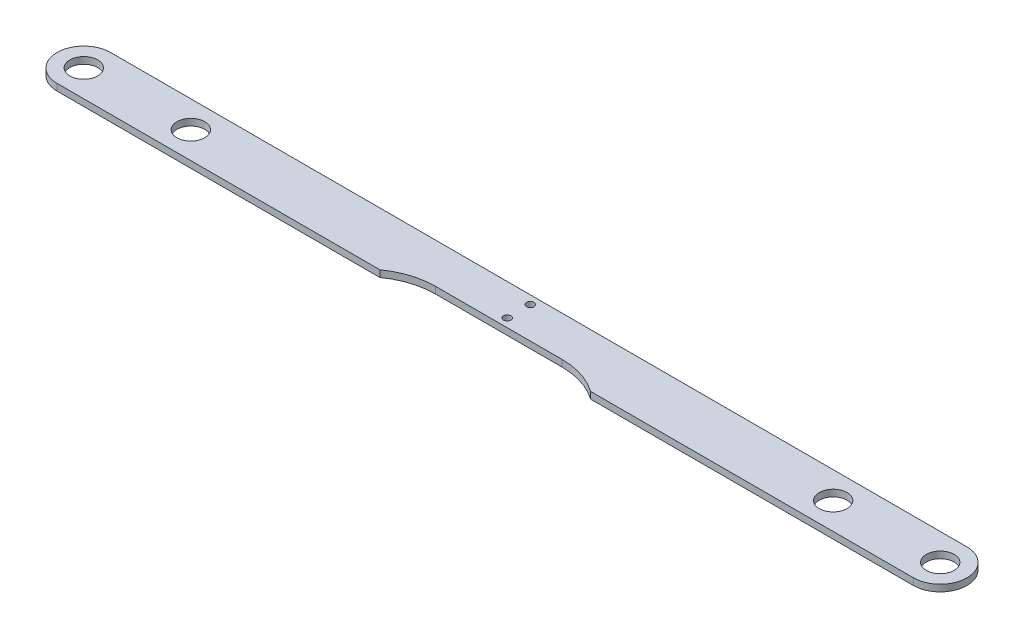
ISO-10303-21;
HEADER;
FILE_DESCRIPTION(('STEP AP214'),'2;1');
FILE_NAME('part.step','',(''),(''),'','','');
FILE_SCHEMA(('AUTOMOTIVE_DESIGN { 1 0 10303 214 1 1 1 1 }'));
ENDSEC;
DATA;
#1=APPLICATION_CONTEXT('core data for automotive mechanical design processes');
#2=APPLICATION_PROTOCOL_DEFINITION('international standard','automotive_design',2000,#1);
#3=PRODUCT_CONTEXT('',#1,'mechanical');
#4=PRODUCT('Part','Part','',(#3));
#5=PRODUCT_RELATED_PRODUCT_CATEGORY('part','',(#4));
#6=PRODUCT_DEFINITION_FORMATION('','',#4);
#7=PRODUCT_DEFINITION_CONTEXT('part definition',#1,'design');
#8=PRODUCT_DEFINITION('design','',#6,#7);
#9=PRODUCT_DEFINITION_SHAPE('','',#8);
#10=(LENGTH_UNIT() NAMED_UNIT(*) SI_UNIT(.MILLI.,.METRE.));
#11=(NAMED_UNIT(*) PLANE_ANGLE_UNIT() SI_UNIT($,.RADIAN.));
#12=(NAMED_UNIT(*) SI_UNIT($,.STERADIAN.) SOLID_ANGLE_UNIT());
#13=UNCERTAINTY_MEASURE_WITH_UNIT(LENGTH_MEASURE(1.E-05),#10,'distance_accuracy_value','');
#14=(GEOMETRIC_REPRESENTATION_CONTEXT(3) GLOBAL_UNCERTAINTY_ASSIGNED_CONTEXT((#13)) GLOBAL_UNIT_ASSIGNED_CONTEXT((#10,
#11,#12)) REPRESENTATION_CONTEXT('',''));
#15=CARTESIAN_POINT('',(0.,0.,0.));
#16=DIRECTION('',(0.,0.,1.));
#17=DIRECTION('',(1.,0.,0.));
#18=AXIS2_PLACEMENT_3D('',#15,#16,#17);
#19=CARTESIAN_POINT('',(101.6,1.5875,1.59999999999999));
#20=DIRECTION('',(0.,-1.,0.));
#21=DIRECTION('',(0.,0.,-1.));
#22=AXIS2_PLACEMENT_3D('',#19,#20,#21);
#23=PLANE('',#22);
#24=CARTESIAN_POINT('',(101.6,1.5875,1.59999999999999));
#25=DIRECTION('',(0.,1.,0.));
#26=DIRECTION('',(0.,0.,-1.));
#27=AXIS2_PLACEMENT_3D('',#24,#25,#26);
#28=CIRCLE('',#27,6.35000000000002);
#29=CARTESIAN_POINT('',(101.6,1.5875,7.94999999999997));
#30=VERTEX_POINT('',#29);
#31=CARTESIAN_POINT('',(101.6,1.5875,-4.75000000000007));
#32=VERTEX_POINT('',#31);
#33=EDGE_CURVE('E146',#30,#32,#28,.T.);
#34=ORIENTED_EDGE('',*,*,#33,.T.);
#35=DIRECTION('',(-1.,0.,0.));
#36=VECTOR('',#35,1.);
#37=CARTESIAN_POINT('',(101.6,1.5875,-4.75000000000007));
#38=LINE('',#37,#36);
#39=CARTESIAN_POINT('',(-101.6,1.5875,-4.75000000000001));
#40=VERTEX_POINT('',#39);
#41=EDGE_CURVE('E94',#32,#40,#38,.T.);
#42=ORIENTED_EDGE('',*,*,#41,.T.);
#43=CARTESIAN_POINT('',(-101.6,1.5875,1.59999999999999));
#44=DIRECTION('',(0.,1.,0.));
#45=DIRECTION('',(0.,0.,1.));
#46=AXIS2_PLACEMENT_3D('',#43,#44,#45);
#47=CIRCLE('',#46,6.35);
#48=CARTESIAN_POINT('',(-101.6,1.5875,7.94999999999999));
#49=VERTEX_POINT('',#48);
#50=EDGE_CURVE('E161',#40,#49,#47,.T.);
#51=ORIENTED_EDGE('',*,*,#50,.T.);
#52=DIRECTION('',(1.,0.,0.));
#53=VECTOR('',#52,1.);
#54=CARTESIAN_POINT('',(-101.6,1.5875,7.94999999999999));
#55=LINE('',#54,#53);
#56=CARTESIAN_POINT('',(-25.,1.5875,7.94999999999999));
#57=VERTEX_POINT('',#56);
#58=EDGE_CURVE('E174',#49,#57,#55,.T.);
#59=ORIENTED_EDGE('',*,*,#58,.T.);
#60=CARTESIAN_POINT('',(-15.,1.5875,21.9750000000001));
#61=DIRECTION('',(0.,-1.,0.));
#62=DIRECTION('',(0.,0.,1.));
#63=AXIS2_PLACEMENT_3D('',#60,#61,#62);
#64=CIRCLE('',#63,17.2250000000001);
#65=CARTESIAN_POINT('',(-15.,1.5875,4.75000000000001));
#66=VERTEX_POINT('',#65);
#67=EDGE_CURVE('E113',#57,#66,#64,.T.);
#68=ORIENTED_EDGE('',*,*,#67,.T.);
#69=DIRECTION('',(1.,0.,0.));
#70=VECTOR('',#69,1.);
#71=CARTESIAN_POINT('',(-15.,1.5875,4.75000000000001));
#72=LINE('',#71,#70);
#73=CARTESIAN_POINT('',(15.,1.5875,4.75));
#74=VERTEX_POINT('',#73);
#75=EDGE_CURVE('E107',#66,#74,#72,.T.);
#76=ORIENTED_EDGE('',*,*,#75,.T.);
#77=CARTESIAN_POINT('',(15.,1.5875,21.975));
#78=DIRECTION('',(0.,-1.,0.));
#79=DIRECTION('',(0.,0.,-1.));
#80=AXIS2_PLACEMENT_3D('',#77,#78,#79);
#81=CIRCLE('',#80,17.225);
#82=CARTESIAN_POINT('',(25.,1.5875,7.94999999999999));
#83=VERTEX_POINT('',#82);
#84=EDGE_CURVE('E111',#74,#83,#81,.T.);
#85=ORIENTED_EDGE('',*,*,#84,.T.);
#86=DIRECTION('',(1.,0.,0.));
#87=VECTOR('',#86,1.);
#88=CARTESIAN_POINT('',(25.,1.5875,7.94999999999999));
#89=LINE('',#88,#87);
#90=EDGE_CURVE('E51',#83,#30,#89,.T.);
#91=ORIENTED_EDGE('',*,*,#90,.T.);
#92=EDGE_LOOP('',(#34,#42,#51,#59,#68,#76,#85,#91));
#93=FACE_BOUND('',#92,.T.);
#94=CARTESIAN_POINT('',(0.,1.5875,-2.75));
#95=DIRECTION('',(0.,1.,0.));
#96=DIRECTION('',(0.,0.,1.));
#97=AXIS2_PLACEMENT_3D('',#94,#95,#96);
#98=CIRCLE('',#97,0.889000000000003);
#99=CARTESIAN_POINT('',(0.,1.5875,-1.861));
#100=VERTEX_POINT('',#99);
#101=EDGE_CURVE('E135',#100,#100,#98,.T.);
#102=ORIENTED_EDGE('',*,*,#101,.F.);
#103=EDGE_LOOP('',(#102));
#104=FACE_BOUND('',#103,.T.);
#105=CARTESIAN_POINT('',(0.,1.5875,2.75));
#106=DIRECTION('',(0.,1.,0.));
#107=DIRECTION('',(0.,0.,1.));
#108=AXIS2_PLACEMENT_3D('',#105,#106,#107);
#109=CIRCLE('',#108,0.889000000000003);
#110=CARTESIAN_POINT('',(0.,1.5875,3.639));
#111=VERTEX_POINT('',#110);
#112=EDGE_CURVE('E183',#111,#111,#109,.T.);
#113=ORIENTED_EDGE('',*,*,#112,.F.);
#114=EDGE_LOOP('',(#113));
#115=FACE_BOUND('',#114,.T.);
#116=CARTESIAN_POINT('',(-76.2,1.5875,1.59999999999999));
#117=DIRECTION('',(0.,1.,0.));
#118=DIRECTION('',(0.,0.,1.));
#119=AXIS2_PLACEMENT_3D('',#116,#117,#118);
#120=CIRCLE('',#119,3.302);
#121=CARTESIAN_POINT('',(-76.2,1.5875,4.90199999999999));
#122=VERTEX_POINT('',#121);
#123=EDGE_CURVE('E189',#122,#122,#120,.T.);
#124=ORIENTED_EDGE('',*,*,#123,.F.);
#125=EDGE_LOOP('',(#124));
#126=FACE_BOUND('',#125,.T.);
#127=CARTESIAN_POINT('',(-101.6,1.5875,1.59999999999999));
#128=DIRECTION('',(0.,1.,0.));
#129=DIRECTION('',(0.,0.,1.));
#130=AXIS2_PLACEMENT_3D('',#127,#128,#129);
#131=CIRCLE('',#130,3.302);
#132=CARTESIAN_POINT('',(-101.6,1.5875,4.90199999999999));
#133=VERTEX_POINT('',#132);
#134=EDGE_CURVE('E195',#133,#133,#131,.T.);
#135=ORIENTED_EDGE('',*,*,#134,.F.);
#136=EDGE_LOOP('',(#135));
#137=FACE_BOUND('',#136,.T.);
#138=CARTESIAN_POINT('',(101.6,1.5875,1.59999999999999));
#139=DIRECTION('',(0.,1.,0.));
#140=DIRECTION('',(0.,0.,1.));
#141=AXIS2_PLACEMENT_3D('',#138,#139,#140);
#142=CIRCLE('',#141,3.302);
#143=CARTESIAN_POINT('',(101.6,1.5875,4.90199999999999));
#144=VERTEX_POINT('',#143);
#145=EDGE_CURVE('E201',#144,#144,#142,.T.);
#146=ORIENTED_EDGE('',*,*,#145,.F.);
#147=EDGE_LOOP('',(#146));
#148=FACE_BOUND('',#147,.T.);
#149=CARTESIAN_POINT('',(76.2,1.5875,1.59999999999999));
#150=DIRECTION('',(0.,1.,0.));
#151=DIRECTION('',(0.,0.,1.));
#152=AXIS2_PLACEMENT_3D('',#149,#150,#151);
#153=CIRCLE('',#152,3.302);
#154=CARTESIAN_POINT('',(76.2,1.5875,4.90199999999999));
#155=VERTEX_POINT('',#154);
#156=EDGE_CURVE('E207',#155,#155,#153,.T.);
#157=ORIENTED_EDGE('',*,*,#156,.F.);
#158=EDGE_LOOP('',(#157));
#159=FACE_BOUND('',#158,.T.);
#160=ADVANCED_FACE('F34',(#93,#104,#115,#126,#137,#148,#159),#23,.F.);
#161=CARTESIAN_POINT('',(101.6,0.,1.59999999999999));
#162=DIRECTION('',(0.,-1.,0.));
#163=DIRECTION('',(0.,0.,-1.));
#164=AXIS2_PLACEMENT_3D('',#161,#162,#163);
#165=PLANE('',#164);
#166=CARTESIAN_POINT('',(101.6,0.,1.59999999999999));
#167=DIRECTION('',(0.,1.,0.));
#168=DIRECTION('',(0.,0.,1.));
#169=AXIS2_PLACEMENT_3D('',#166,#167,#168);
#170=CIRCLE('',#169,3.302);
#171=CARTESIAN_POINT('',(101.6,0.,4.90199999999999));
#172=VERTEX_POINT('',#171);
#173=EDGE_CURVE('E204',#172,#172,#170,.T.);
#174=ORIENTED_EDGE('',*,*,#173,.T.);
#175=EDGE_LOOP('',(#174));
#176=FACE_BOUND('',#175,.T.);
#177=CARTESIAN_POINT('',(-76.2,0.,1.59999999999999));
#178=DIRECTION('',(0.,1.,0.));
#179=DIRECTION('',(0.,0.,1.));
#180=AXIS2_PLACEMENT_3D('',#177,#178,#179);
#181=CIRCLE('',#180,3.302);
#182=CARTESIAN_POINT('',(-76.2,0.,4.90199999999999));
#183=VERTEX_POINT('',#182);
#184=EDGE_CURVE('E192',#183,#183,#181,.T.);
#185=ORIENTED_EDGE('',*,*,#184,.T.);
#186=EDGE_LOOP('',(#185));
#187=FACE_BOUND('',#186,.T.);
#188=CARTESIAN_POINT('',(0.,0.,-2.75));
#189=DIRECTION('',(0.,1.,0.));
#190=DIRECTION('',(0.,0.,1.));
#191=AXIS2_PLACEMENT_3D('',#188,#189,#190);
#192=CIRCLE('',#191,0.889000000000003);
#193=CARTESIAN_POINT('',(0.,0.,-1.861));
#194=VERTEX_POINT('',#193);
#195=EDGE_CURVE('E180',#194,#194,#192,.T.);
#196=ORIENTED_EDGE('',*,*,#195,.T.);
#197=EDGE_LOOP('',(#196));
#198=FACE_BOUND('',#197,.T.);
#199=CARTESIAN_POINT('',(101.6,0.,1.59999999999999));
#200=DIRECTION('',(0.,1.,0.));
#201=DIRECTION('',(0.,0.,-1.));
#202=AXIS2_PLACEMENT_3D('',#199,#200,#201);
#203=CIRCLE('',#202,6.35000000000002);
#204=CARTESIAN_POINT('',(101.6,0.,7.94999999999997));
#205=VERTEX_POINT('',#204);
#206=CARTESIAN_POINT('',(101.6,0.,-4.75000000000007));
#207=VERTEX_POINT('',#206);
#208=EDGE_CURVE('E131',#205,#207,#203,.T.);
#209=ORIENTED_EDGE('',*,*,#208,.F.);
#210=DIRECTION('',(1.,0.,0.));
#211=VECTOR('',#210,1.);
#212=CARTESIAN_POINT('',(25.,0.,7.94999999999999));
#213=LINE('',#212,#211);
#214=CARTESIAN_POINT('',(25.,0.,7.94999999999999));
#215=VERTEX_POINT('',#214);
#216=EDGE_CURVE('E86',#215,#205,#213,.T.);
#217=ORIENTED_EDGE('',*,*,#216,.F.);
#218=CARTESIAN_POINT('',(15.,0.,21.975));
#219=DIRECTION('',(0.,-1.,0.));
#220=DIRECTION('',(0.,0.,-1.));
#221=AXIS2_PLACEMENT_3D('',#218,#219,#220);
#222=CIRCLE('',#221,17.225);
#223=CARTESIAN_POINT('',(15.,0.,4.75));
#224=VERTEX_POINT('',#223);
#225=EDGE_CURVE('E80',#224,#215,#222,.T.);
#226=ORIENTED_EDGE('',*,*,#225,.F.);
#227=DIRECTION('',(1.,0.,0.));
#228=VECTOR('',#227,1.);
#229=CARTESIAN_POINT('',(-15.,0.,4.75000000000001));
#230=LINE('',#229,#228);
#231=CARTESIAN_POINT('',(-15.,0.,4.75000000000001));
#232=VERTEX_POINT('',#231);
#233=EDGE_CURVE('E121',#232,#224,#230,.T.);
#234=ORIENTED_EDGE('',*,*,#233,.F.);
#235=CARTESIAN_POINT('',(-15.,0.,21.9750000000001));
#236=DIRECTION('',(0.,-1.,0.));
#237=DIRECTION('',(0.,0.,1.));
#238=AXIS2_PLACEMENT_3D('',#235,#236,#237);
#239=CIRCLE('',#238,17.2250000000001);
#240=CARTESIAN_POINT('',(-25.,0.,7.94999999999999));
#241=VERTEX_POINT('',#240);
#242=EDGE_CURVE('E141',#241,#232,#239,.T.);
#243=ORIENTED_EDGE('',*,*,#242,.F.);
#244=DIRECTION('',(1.,0.,0.));
#245=VECTOR('',#244,1.);
#246=CARTESIAN_POINT('',(-101.6,0.,7.94999999999999));
#247=LINE('',#246,#245);
#248=CARTESIAN_POINT('',(-101.6,0.,7.94999999999999));
#249=VERTEX_POINT('',#248);
#250=EDGE_CURVE('E139',#249,#241,#247,.T.);
#251=ORIENTED_EDGE('',*,*,#250,.F.);
#252=CARTESIAN_POINT('',(-101.6,0.,1.59999999999999));
#253=DIRECTION('',(0.,1.,0.));
#254=DIRECTION('',(0.,0.,1.));
#255=AXIS2_PLACEMENT_3D('',#252,#253,#254);
#256=CIRCLE('',#255,6.35);
#257=CARTESIAN_POINT('',(-101.6,0.,-4.75000000000001));
#258=VERTEX_POINT('',#257);
#259=EDGE_CURVE('E137',#258,#249,#256,.T.);
#260=ORIENTED_EDGE('',*,*,#259,.F.);
#261=DIRECTION('',(-1.,0.,0.));
#262=VECTOR('',#261,1.);
#263=CARTESIAN_POINT('',(101.6,0.,-4.75000000000007));
#264=LINE('',#263,#262);
#265=EDGE_CURVE('E134',#207,#258,#264,.T.);
#266=ORIENTED_EDGE('',*,*,#265,.F.);
#267=EDGE_LOOP('',(#209,#217,#226,#234,#243,#251,#260,#266));
#268=FACE_BOUND('',#267,.T.);
#269=CARTESIAN_POINT('',(0.,0.,2.75));
#270=DIRECTION('',(0.,1.,0.));
#271=DIRECTION('',(0.,0.,1.));
#272=AXIS2_PLACEMENT_3D('',#269,#270,#271);
#273=CIRCLE('',#272,0.889000000000003);
#274=CARTESIAN_POINT('',(0.,0.,3.639));
#275=VERTEX_POINT('',#274);
#276=EDGE_CURVE('E186',#275,#275,#273,.T.);
#277=ORIENTED_EDGE('',*,*,#276,.T.);
#278=EDGE_LOOP('',(#277));
#279=FACE_BOUND('',#278,.T.);
#280=CARTESIAN_POINT('',(-101.6,0.,1.59999999999999));
#281=DIRECTION('',(0.,1.,0.));
#282=DIRECTION('',(0.,0.,1.));
#283=AXIS2_PLACEMENT_3D('',#280,#281,#282);
#284=CIRCLE('',#283,3.302);
#285=CARTESIAN_POINT('',(-101.6,0.,4.90199999999999));
#286=VERTEX_POINT('',#285);
#287=EDGE_CURVE('E198',#286,#286,#284,.T.);
#288=ORIENTED_EDGE('',*,*,#287,.T.);
#289=EDGE_LOOP('',(#288));
#290=FACE_BOUND('',#289,.T.);
#291=CARTESIAN_POINT('',(76.2,0.,1.59999999999999));
#292=DIRECTION('',(0.,1.,0.));
#293=DIRECTION('',(0.,0.,1.));
#294=AXIS2_PLACEMENT_3D('',#291,#292,#293);
#295=CIRCLE('',#294,3.302);
#296=CARTESIAN_POINT('',(76.2,0.,4.90199999999999));
#297=VERTEX_POINT('',#296);
#298=EDGE_CURVE('E210',#297,#297,#295,.T.);
#299=ORIENTED_EDGE('',*,*,#298,.T.);
#300=EDGE_LOOP('',(#299));
#301=FACE_BOUND('',#300,.T.);
#302=ADVANCED_FACE('F165',(#176,#187,#198,#268,#279,#290,#301),#165,.T.);
#303=CARTESIAN_POINT('',(101.6,1.5875,1.59999999999999));
#304=DIRECTION('',(0.,-1.,0.));
#305=DIRECTION('',(0.,0.,-1.));
#306=AXIS2_PLACEMENT_3D('',#303,#304,#305);
#307=CYLINDRICAL_SURFACE('',#306,6.35000000000002);
#308=ORIENTED_EDGE('',*,*,#208,.T.);
#309=DIRECTION('',(0.,-1.,0.));
#310=VECTOR('',#309,1.);
#311=CARTESIAN_POINT('',(101.6,1.5875,-4.75000000000007));
#312=LINE('',#311,#310);
#313=EDGE_CURVE('E11',#32,#207,#312,.T.);
#314=ORIENTED_EDGE('',*,*,#313,.F.);
#315=ORIENTED_EDGE('',*,*,#33,.F.);
#316=DIRECTION('',(0.,-1.,0.));
#317=VECTOR('',#316,1.);
#318=CARTESIAN_POINT('',(101.6,1.5875,7.94999999999997));
#319=LINE('',#318,#317);
#320=EDGE_CURVE('E127',#30,#205,#319,.T.);
#321=ORIENTED_EDGE('',*,*,#320,.T.);
#322=EDGE_LOOP('',(#308,#314,#315,#321));
#323=FACE_BOUND('',#322,.T.);
#324=ADVANCED_FACE('F36',(#323),#307,.T.);
#325=CARTESIAN_POINT('',(101.6,1.5875,-4.75000000000007));
#326=DIRECTION('',(0.,0.,1.));
#327=DIRECTION('',(1.,0.,0.));
#328=AXIS2_PLACEMENT_3D('',#325,#326,#327);
#329=PLANE('',#328);
#330=ORIENTED_EDGE('',*,*,#265,.T.);
#331=DIRECTION('',(0.,-1.,0.));
#332=VECTOR('',#331,1.);
#333=CARTESIAN_POINT('',(-101.6,1.5875,-4.75000000000001));
#334=LINE('',#333,#332);
#335=EDGE_CURVE('E43',#40,#258,#334,.T.);
#336=ORIENTED_EDGE('',*,*,#335,.F.);
#337=ORIENTED_EDGE('',*,*,#41,.F.);
#338=ORIENTED_EDGE('',*,*,#313,.T.);
#339=EDGE_LOOP('',(#330,#336,#337,#338));
#340=FACE_BOUND('',#339,.T.);
#341=ADVANCED_FACE('F242',(#340),#329,.F.);
#342=CARTESIAN_POINT('',(-101.6,1.5875,1.59999999999999));
#343=DIRECTION('',(0.,-1.,0.));
#344=DIRECTION('',(0.,0.,-1.));
#345=AXIS2_PLACEMENT_3D('',#342,#343,#344);
#346=CYLINDRICAL_SURFACE('',#345,6.35);
#347=ORIENTED_EDGE('',*,*,#259,.T.);
#348=DIRECTION('',(0.,-1.,0.));
#349=VECTOR('',#348,1.);
#350=CARTESIAN_POINT('',(-101.6,1.5875,7.94999999999999));
#351=LINE('',#350,#349);
#352=EDGE_CURVE('E153',#49,#249,#351,.T.);
#353=ORIENTED_EDGE('',*,*,#352,.F.);
#354=ORIENTED_EDGE('',*,*,#50,.F.);
#355=ORIENTED_EDGE('',*,*,#335,.T.);
#356=EDGE_LOOP('',(#347,#353,#354,#355));
#357=FACE_BOUND('',#356,.T.);
#358=ADVANCED_FACE('F159',(#357),#346,.T.);
#359=CARTESIAN_POINT('',(-101.6,1.5875,7.94999999999999));
#360=DIRECTION('',(0.,0.,-1.));
#361=DIRECTION('',(-1.,0.,0.));
#362=AXIS2_PLACEMENT_3D('',#359,#360,#361);
#363=PLANE('',#362);
#364=ORIENTED_EDGE('',*,*,#250,.T.);
#365=DIRECTION('',(0.,-1.,0.));
#366=VECTOR('',#365,1.);
#367=CARTESIAN_POINT('',(-25.,1.5875,7.94999999999999));
#368=LINE('',#367,#366);
#369=EDGE_CURVE('E150',#57,#241,#368,.T.);
#370=ORIENTED_EDGE('',*,*,#369,.F.);
#371=ORIENTED_EDGE('',*,*,#58,.F.);
#372=ORIENTED_EDGE('',*,*,#352,.T.);
#373=EDGE_LOOP('',(#364,#370,#371,#372));
#374=FACE_BOUND('',#373,.T.);
#375=ADVANCED_FACE('F170',(#374),#363,.F.);
#376=CARTESIAN_POINT('',(-15.,1.5875,21.9750000000001));
#377=DIRECTION('',(0.,-1.,0.));
#378=DIRECTION('',(0.,0.,-1.));
#379=AXIS2_PLACEMENT_3D('',#376,#377,#378);
#380=CYLINDRICAL_SURFACE('',#379,17.2250000000001);
#381=ORIENTED_EDGE('',*,*,#242,.T.);
#382=DIRECTION('',(0.,-1.,0.));
#383=VECTOR('',#382,1.);
#384=CARTESIAN_POINT('',(-15.,1.5875,4.75000000000001));
#385=LINE('',#384,#383);
#386=EDGE_CURVE('E122',#66,#232,#385,.T.);
#387=ORIENTED_EDGE('',*,*,#386,.F.);
#388=ORIENTED_EDGE('',*,*,#67,.F.);
#389=ORIENTED_EDGE('',*,*,#369,.T.);
#390=EDGE_LOOP('',(#381,#387,#388,#389));
#391=FACE_BOUND('',#390,.T.);
#392=ADVANCED_FACE('F173',(#391),#380,.F.);
#393=CARTESIAN_POINT('',(-15.,1.5875,4.75000000000001));
#394=DIRECTION('',(0.,0.,-1.));
#395=DIRECTION('',(-1.,0.,0.));
#396=AXIS2_PLACEMENT_3D('',#393,#394,#395);
#397=PLANE('',#396);
#398=ORIENTED_EDGE('',*,*,#233,.T.);
#399=DIRECTION('',(0.,-1.,0.));
#400=VECTOR('',#399,1.);
#401=CARTESIAN_POINT('',(15.,1.5875,4.75));
#402=LINE('',#401,#400);
#403=EDGE_CURVE('E118',#74,#224,#402,.T.);
#404=ORIENTED_EDGE('',*,*,#403,.F.);
#405=ORIENTED_EDGE('',*,*,#75,.F.);
#406=ORIENTED_EDGE('',*,*,#386,.T.);
#407=EDGE_LOOP('',(#398,#404,#405,#406));
#408=FACE_BOUND('',#407,.T.);
#409=ADVANCED_FACE('F119',(#408),#397,.F.);
#410=CARTESIAN_POINT('',(15.,1.5875,21.975));
#411=DIRECTION('',(0.,-1.,0.));
#412=DIRECTION('',(0.,0.,-1.));
#413=AXIS2_PLACEMENT_3D('',#410,#411,#412);
#414=CYLINDRICAL_SURFACE('',#413,17.225);
#415=ORIENTED_EDGE('',*,*,#225,.T.);
#416=DIRECTION('',(0.,-1.,0.));
#417=VECTOR('',#416,1.);
#418=CARTESIAN_POINT('',(25.,1.5875,7.94999999999999));
#419=LINE('',#418,#417);
#420=EDGE_CURVE('E123',#83,#215,#419,.T.);
#421=ORIENTED_EDGE('',*,*,#420,.F.);
#422=ORIENTED_EDGE('',*,*,#84,.F.);
#423=ORIENTED_EDGE('',*,*,#403,.T.);
#424=EDGE_LOOP('',(#415,#421,#422,#423));
#425=FACE_BOUND('',#424,.T.);
#426=ADVANCED_FACE('F125',(#425),#414,.F.);
#427=CARTESIAN_POINT('',(25.,1.5875,7.94999999999999));
#428=DIRECTION('',(0.,0.,-1.));
#429=DIRECTION('',(-1.,0.,0.));
#430=AXIS2_PLACEMENT_3D('',#427,#428,#429);
#431=PLANE('',#430);
#432=ORIENTED_EDGE('',*,*,#216,.T.);
#433=ORIENTED_EDGE('',*,*,#320,.F.);
#434=ORIENTED_EDGE('',*,*,#90,.F.);
#435=ORIENTED_EDGE('',*,*,#420,.T.);
#436=EDGE_LOOP('',(#432,#433,#434,#435));
#437=FACE_BOUND('',#436,.T.);
#438=ADVANCED_FACE('F230',(#437),#431,.F.);
#439=CARTESIAN_POINT('',(0.,1.5875,-2.75));
#440=DIRECTION('',(0.,-1.,0.));
#441=DIRECTION('',(0.,0.,-1.));
#442=AXIS2_PLACEMENT_3D('',#439,#440,#441);
#443=CYLINDRICAL_SURFACE('',#442,0.889000000000003);
#444=ORIENTED_EDGE('',*,*,#101,.T.);
#445=EDGE_LOOP('',(#444));
#446=FACE_BOUND('',#445,.T.);
#447=ORIENTED_EDGE('',*,*,#195,.F.);
#448=EDGE_LOOP('',(#447));
#449=FACE_BOUND('',#448,.T.);
#450=ADVANCED_FACE('F227',(#446,#449),#443,.F.);
#451=CARTESIAN_POINT('',(0.,1.5875,2.75));
#452=DIRECTION('',(0.,-1.,0.));
#453=DIRECTION('',(0.,0.,-1.));
#454=AXIS2_PLACEMENT_3D('',#451,#452,#453);
#455=CYLINDRICAL_SURFACE('',#454,0.889000000000003);
#456=ORIENTED_EDGE('',*,*,#112,.T.);
#457=EDGE_LOOP('',(#456));
#458=FACE_BOUND('',#457,.T.);
#459=ORIENTED_EDGE('',*,*,#276,.F.);
#460=EDGE_LOOP('',(#459));
#461=FACE_BOUND('',#460,.T.);
#462=ADVANCED_FACE('F306',(#458,#461),#455,.F.);
#463=CARTESIAN_POINT('',(-76.2,1.5875,1.59999999999999));
#464=DIRECTION('',(0.,-1.,0.));
#465=DIRECTION('',(0.,0.,-1.));
#466=AXIS2_PLACEMENT_3D('',#463,#464,#465);
#467=CYLINDRICAL_SURFACE('',#466,3.302);
#468=ORIENTED_EDGE('',*,*,#123,.T.);
#469=EDGE_LOOP('',(#468));
#470=FACE_BOUND('',#469,.T.);
#471=ORIENTED_EDGE('',*,*,#184,.F.);
#472=EDGE_LOOP('',(#471));
#473=FACE_BOUND('',#472,.T.);
#474=ADVANCED_FACE('F314',(#470,#473),#467,.F.);
#475=CARTESIAN_POINT('',(-101.6,1.5875,1.59999999999999));
#476=DIRECTION('',(0.,-1.,0.));
#477=DIRECTION('',(0.,0.,-1.));
#478=AXIS2_PLACEMENT_3D('',#475,#476,#477);
#479=CYLINDRICAL_SURFACE('',#478,3.302);
#480=ORIENTED_EDGE('',*,*,#134,.T.);
#481=EDGE_LOOP('',(#480));
#482=FACE_BOUND('',#481,.T.);
#483=ORIENTED_EDGE('',*,*,#287,.F.);
#484=EDGE_LOOP('',(#483));
#485=FACE_BOUND('',#484,.T.);
#486=ADVANCED_FACE('F322',(#482,#485),#479,.F.);
#487=CARTESIAN_POINT('',(101.6,1.5875,1.59999999999999));
#488=DIRECTION('',(0.,-1.,0.));
#489=DIRECTION('',(0.,0.,-1.));
#490=AXIS2_PLACEMENT_3D('',#487,#488,#489);
#491=CYLINDRICAL_SURFACE('',#490,3.302);
#492=ORIENTED_EDGE('',*,*,#145,.T.);
#493=EDGE_LOOP('',(#492));
#494=FACE_BOUND('',#493,.T.);
#495=ORIENTED_EDGE('',*,*,#173,.F.);
#496=EDGE_LOOP('',(#495));
#497=FACE_BOUND('',#496,.T.);
#498=ADVANCED_FACE('F331',(#494,#497),#491,.F.);
#499=CARTESIAN_POINT('',(76.2,1.5875,1.59999999999999));
#500=DIRECTION('',(0.,-1.,0.));
#501=DIRECTION('',(0.,0.,-1.));
#502=AXIS2_PLACEMENT_3D('',#499,#500,#501);
#503=CYLINDRICAL_SURFACE('',#502,3.302);
#504=ORIENTED_EDGE('',*,*,#156,.T.);
#505=EDGE_LOOP('',(#504));
#506=FACE_BOUND('',#505,.T.);
#507=ORIENTED_EDGE('',*,*,#298,.F.);
#508=EDGE_LOOP('',(#507));
#509=FACE_BOUND('',#508,.T.);
#510=ADVANCED_FACE('F216',(#506,#509),#503,.F.);
#511=CLOSED_SHELL('',(#160,#302,#324,#341,#358,#375,#392,#409,#426,#438,#450,#462,#474,#486,
#498,#510));
#512=MANIFOLD_SOLID_BREP('B2',#511);
#513=ADVANCED_BREP_SHAPE_REPRESENTATION('',(#18,#512),#14);
#514=SHAPE_DEFINITION_REPRESENTATION(#9,#513);
ENDSEC;
END-ISO-10303-21;
